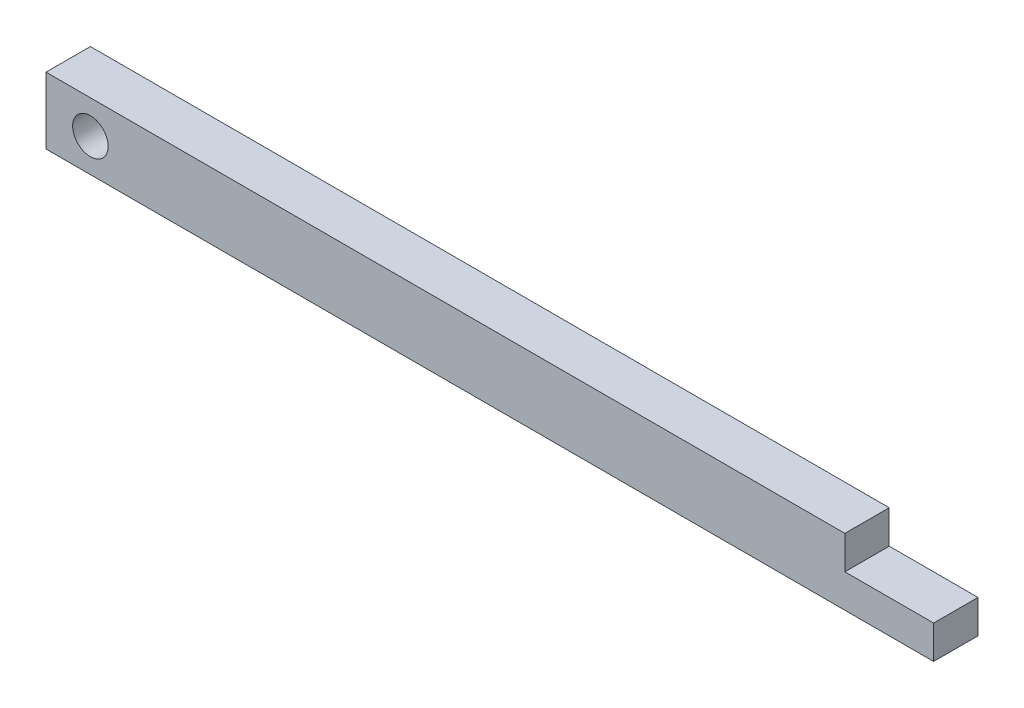
ISO-10303-21;
HEADER;
FILE_DESCRIPTION(('STEP AP214'),'2;1');
FILE_NAME('part.step','',(''),(''),'','','');
FILE_SCHEMA(('AUTOMOTIVE_DESIGN { 1 0 10303 214 1 1 1 1 }'));
ENDSEC;
DATA;
#1=APPLICATION_CONTEXT('core data for automotive mechanical design processes');
#2=APPLICATION_PROTOCOL_DEFINITION('international standard','automotive_design',2000,#1);
#3=PRODUCT_CONTEXT('',#1,'mechanical');
#4=PRODUCT('Part','Part','',(#3));
#5=PRODUCT_RELATED_PRODUCT_CATEGORY('part','',(#4));
#6=PRODUCT_DEFINITION_FORMATION('','',#4);
#7=PRODUCT_DEFINITION_CONTEXT('part definition',#1,'design');
#8=PRODUCT_DEFINITION('design','',#6,#7);
#9=PRODUCT_DEFINITION_SHAPE('','',#8);
#10=(LENGTH_UNIT() NAMED_UNIT(*) SI_UNIT(.MILLI.,.METRE.));
#11=(NAMED_UNIT(*) PLANE_ANGLE_UNIT() SI_UNIT($,.RADIAN.));
#12=(NAMED_UNIT(*) SI_UNIT($,.STERADIAN.) SOLID_ANGLE_UNIT());
#13=UNCERTAINTY_MEASURE_WITH_UNIT(LENGTH_MEASURE(1.E-05),#10,'distance_accuracy_value','');
#14=(GEOMETRIC_REPRESENTATION_CONTEXT(3) GLOBAL_UNCERTAINTY_ASSIGNED_CONTEXT((#13)) GLOBAL_UNIT_ASSIGNED_CONTEXT((#10,
#11,#12)) REPRESENTATION_CONTEXT('',''));
#15=CARTESIAN_POINT('',(0.,0.,0.));
#16=DIRECTION('',(0.,0.,1.));
#17=DIRECTION('',(1.,0.,0.));
#18=AXIS2_PLACEMENT_3D('',#15,#16,#17);
#19=CARTESIAN_POINT('',(0.,0.,10.));
#20=DIRECTION('',(-1.,0.,0.));
#21=DIRECTION('',(0.,0.,1.));
#22=AXIS2_PLACEMENT_3D('',#19,#20,#21);
#23=PLANE('',#22);
#24=DIRECTION('',(0.,1.,0.));
#25=VECTOR('',#24,1.);
#26=CARTESIAN_POINT('',(0.,0.,0.));
#27=LINE('',#26,#25);
#28=CARTESIAN_POINT('',(0.,0.,0.));
#29=VERTEX_POINT('',#28);
#30=CARTESIAN_POINT('',(0.,15.,0.));
#31=VERTEX_POINT('',#30);
#32=EDGE_CURVE('E131',#29,#31,#27,.T.);
#33=ORIENTED_EDGE('',*,*,#32,.F.);
#34=DIRECTION('',(0.,0.,-1.));
#35=VECTOR('',#34,1.);
#36=CARTESIAN_POINT('',(0.,0.,10.));
#37=LINE('',#36,#35);
#38=CARTESIAN_POINT('',(0.,0.,10.));
#39=VERTEX_POINT('',#38);
#40=EDGE_CURVE('E11',#39,#29,#37,.T.);
#41=ORIENTED_EDGE('',*,*,#40,.F.);
#42=DIRECTION('',(0.,1.,0.));
#43=VECTOR('',#42,1.);
#44=CARTESIAN_POINT('',(0.,0.,10.));
#45=LINE('',#44,#43);
#46=CARTESIAN_POINT('',(0.,15.,10.));
#47=VERTEX_POINT('',#46);
#48=EDGE_CURVE('E150',#39,#47,#45,.T.);
#49=ORIENTED_EDGE('',*,*,#48,.T.);
#50=DIRECTION('',(0.,0.,-1.));
#51=VECTOR('',#50,1.);
#52=CARTESIAN_POINT('',(0.,15.,10.));
#53=LINE('',#52,#51);
#54=EDGE_CURVE('E42',#47,#31,#53,.T.);
#55=ORIENTED_EDGE('',*,*,#54,.T.);
#56=EDGE_LOOP('',(#33,#41,#49,#55));
#57=FACE_BOUND('',#56,.T.);
#58=ADVANCED_FACE('F39',(#57),#23,.T.);
#59=CARTESIAN_POINT('',(0.,0.,10.));
#60=DIRECTION('',(0.,1.,0.));
#61=DIRECTION('',(0.,0.,1.));
#62=AXIS2_PLACEMENT_3D('',#59,#60,#61);
#63=PLANE('',#62);
#64=DIRECTION('',(1.,0.,0.));
#65=VECTOR('',#64,1.);
#66=CARTESIAN_POINT('',(0.,0.,0.));
#67=LINE('',#66,#65);
#68=CARTESIAN_POINT('',(200.,0.,0.));
#69=VERTEX_POINT('',#68);
#70=EDGE_CURVE('E79',#29,#69,#67,.T.);
#71=ORIENTED_EDGE('',*,*,#70,.T.);
#72=DIRECTION('',(0.,0.,-1.));
#73=VECTOR('',#72,1.);
#74=CARTESIAN_POINT('',(200.,0.,10.));
#75=LINE('',#74,#73);
#76=CARTESIAN_POINT('',(200.,0.,10.));
#77=VERTEX_POINT('',#76);
#78=EDGE_CURVE('E49',#77,#69,#75,.T.);
#79=ORIENTED_EDGE('',*,*,#78,.F.);
#80=DIRECTION('',(1.,0.,0.));
#81=VECTOR('',#80,1.);
#82=CARTESIAN_POINT('',(0.,0.,10.));
#83=LINE('',#82,#81);
#84=EDGE_CURVE('E104',#39,#77,#83,.T.);
#85=ORIENTED_EDGE('',*,*,#84,.F.);
#86=ORIENTED_EDGE('',*,*,#40,.T.);
#87=EDGE_LOOP('',(#71,#79,#85,#86));
#88=FACE_BOUND('',#87,.T.);
#89=ADVANCED_FACE('F192',(#88),#63,.F.);
#90=CARTESIAN_POINT('',(200.,0.,10.));
#91=DIRECTION('',(-1.,0.,0.));
#92=DIRECTION('',(0.,0.,1.));
#93=AXIS2_PLACEMENT_3D('',#90,#91,#92);
#94=PLANE('',#93);
#95=DIRECTION('',(0.,1.,0.));
#96=VECTOR('',#95,1.);
#97=CARTESIAN_POINT('',(200.,0.,0.));
#98=LINE('',#97,#96);
#99=CARTESIAN_POINT('',(200.,7.5,0.));
#100=VERTEX_POINT('',#99);
#101=EDGE_CURVE('E112',#69,#100,#98,.T.);
#102=ORIENTED_EDGE('',*,*,#101,.T.);
#103=DIRECTION('',(0.,0.,-1.));
#104=VECTOR('',#103,1.);
#105=CARTESIAN_POINT('',(200.,7.5,10.));
#106=LINE('',#105,#104);
#107=CARTESIAN_POINT('',(200.,7.5,10.));
#108=VERTEX_POINT('',#107);
#109=EDGE_CURVE('E109',#108,#100,#106,.T.);
#110=ORIENTED_EDGE('',*,*,#109,.F.);
#111=DIRECTION('',(0.,1.,0.));
#112=VECTOR('',#111,1.);
#113=CARTESIAN_POINT('',(200.,0.,10.));
#114=LINE('',#113,#112);
#115=EDGE_CURVE('E97',#77,#108,#114,.T.);
#116=ORIENTED_EDGE('',*,*,#115,.F.);
#117=ORIENTED_EDGE('',*,*,#78,.T.);
#118=EDGE_LOOP('',(#102,#110,#116,#117));
#119=FACE_BOUND('',#118,.T.);
#120=ADVANCED_FACE('F110',(#119),#94,.F.);
#121=CARTESIAN_POINT('',(200.,7.5,10.));
#122=DIRECTION('',(0.,-1.,0.));
#123=DIRECTION('',(1.,0.,0.));
#124=AXIS2_PLACEMENT_3D('',#121,#122,#123);
#125=PLANE('',#124);
#126=DIRECTION('',(-1.,0.,0.));
#127=VECTOR('',#126,1.);
#128=CARTESIAN_POINT('',(200.,7.5,0.));
#129=LINE('',#128,#127);
#130=CARTESIAN_POINT('',(180.,7.5,0.));
#131=VERTEX_POINT('',#130);
#132=EDGE_CURVE('E144',#100,#131,#129,.T.);
#133=ORIENTED_EDGE('',*,*,#132,.T.);
#134=DIRECTION('',(0.,0.,-1.));
#135=VECTOR('',#134,1.);
#136=CARTESIAN_POINT('',(180.,7.5,10.));
#137=LINE('',#136,#135);
#138=CARTESIAN_POINT('',(180.,7.5,10.));
#139=VERTEX_POINT('',#138);
#140=EDGE_CURVE('E116',#139,#131,#137,.T.);
#141=ORIENTED_EDGE('',*,*,#140,.F.);
#142=DIRECTION('',(-1.,0.,0.));
#143=VECTOR('',#142,1.);
#144=CARTESIAN_POINT('',(200.,7.5,10.));
#145=LINE('',#144,#143);
#146=EDGE_CURVE('E102',#108,#139,#145,.T.);
#147=ORIENTED_EDGE('',*,*,#146,.F.);
#148=ORIENTED_EDGE('',*,*,#109,.T.);
#149=EDGE_LOOP('',(#133,#141,#147,#148));
#150=FACE_BOUND('',#149,.T.);
#151=ADVANCED_FACE('F118',(#150),#125,.F.);
#152=CARTESIAN_POINT('',(180.,7.5,10.));
#153=DIRECTION('',(-1.,0.,0.));
#154=DIRECTION('',(0.,0.,1.));
#155=AXIS2_PLACEMENT_3D('',#152,#153,#154);
#156=PLANE('',#155);
#157=DIRECTION('',(0.,1.,0.));
#158=VECTOR('',#157,1.);
#159=CARTESIAN_POINT('',(180.,7.5,0.));
#160=LINE('',#159,#158);
#161=CARTESIAN_POINT('',(180.,15.,0.));
#162=VERTEX_POINT('',#161);
#163=EDGE_CURVE('E140',#131,#162,#160,.T.);
#164=ORIENTED_EDGE('',*,*,#163,.T.);
#165=DIRECTION('',(0.,0.,-1.));
#166=VECTOR('',#165,1.);
#167=CARTESIAN_POINT('',(180.,15.,10.));
#168=LINE('',#167,#166);
#169=CARTESIAN_POINT('',(180.,15.,10.));
#170=VERTEX_POINT('',#169);
#171=EDGE_CURVE('E155',#170,#162,#168,.T.);
#172=ORIENTED_EDGE('',*,*,#171,.F.);
#173=DIRECTION('',(0.,1.,0.));
#174=VECTOR('',#173,1.);
#175=CARTESIAN_POINT('',(180.,7.5,10.));
#176=LINE('',#175,#174);
#177=EDGE_CURVE('E122',#139,#170,#176,.T.);
#178=ORIENTED_EDGE('',*,*,#177,.F.);
#179=ORIENTED_EDGE('',*,*,#140,.T.);
#180=EDGE_LOOP('',(#164,#172,#178,#179));
#181=FACE_BOUND('',#180,.T.);
#182=ADVANCED_FACE('F164',(#181),#156,.F.);
#183=CARTESIAN_POINT('',(0.,15.,10.));
#184=DIRECTION('',(0.,1.,0.));
#185=DIRECTION('',(0.,0.,1.));
#186=AXIS2_PLACEMENT_3D('',#183,#184,#185);
#187=PLANE('',#186);
#188=DIRECTION('',(1.,0.,0.));
#189=VECTOR('',#188,1.);
#190=CARTESIAN_POINT('',(0.,15.,0.));
#191=LINE('',#190,#189);
#192=EDGE_CURVE('E135',#31,#162,#191,.T.);
#193=ORIENTED_EDGE('',*,*,#192,.F.);
#194=ORIENTED_EDGE('',*,*,#54,.F.);
#195=DIRECTION('',(1.,0.,0.));
#196=VECTOR('',#195,1.);
#197=CARTESIAN_POINT('',(0.,15.,10.));
#198=LINE('',#197,#196);
#199=EDGE_CURVE('E125',#47,#170,#198,.T.);
#200=ORIENTED_EDGE('',*,*,#199,.T.);
#201=ORIENTED_EDGE('',*,*,#171,.T.);
#202=EDGE_LOOP('',(#193,#194,#200,#201));
#203=FACE_BOUND('',#202,.T.);
#204=ADVANCED_FACE('F159',(#203),#187,.T.);
#205=CARTESIAN_POINT('',(0.,0.,10.));
#206=DIRECTION('',(0.,0.,-1.));
#207=DIRECTION('',(-1.,0.,0.));
#208=AXIS2_PLACEMENT_3D('',#205,#206,#207);
#209=PLANE('',#208);
#210=CARTESIAN_POINT('',(10.,7.5,10.));
#211=DIRECTION('',(0.,0.,1.));
#212=DIRECTION('',(1.,0.,0.));
#213=AXIS2_PLACEMENT_3D('',#210,#211,#212);
#214=CIRCLE('',#213,4.);
#215=CARTESIAN_POINT('',(14.,7.5,10.));
#216=VERTEX_POINT('',#215);
#217=EDGE_CURVE('E169',#216,#216,#214,.T.);
#218=ORIENTED_EDGE('',*,*,#217,.F.);
#219=EDGE_LOOP('',(#218));
#220=FACE_BOUND('',#219,.T.);
#221=ORIENTED_EDGE('',*,*,#48,.F.);
#222=ORIENTED_EDGE('',*,*,#84,.T.);
#223=ORIENTED_EDGE('',*,*,#115,.T.);
#224=ORIENTED_EDGE('',*,*,#146,.T.);
#225=ORIENTED_EDGE('',*,*,#177,.T.);
#226=ORIENTED_EDGE('',*,*,#199,.F.);
#227=EDGE_LOOP('',(#221,#222,#223,#224,#225,#226));
#228=FACE_BOUND('',#227,.T.);
#229=ADVANCED_FACE('F100',(#220,#228),#209,.F.);
#230=CARTESIAN_POINT('',(0.,0.,0.));
#231=DIRECTION('',(0.,0.,-1.));
#232=DIRECTION('',(-1.,0.,0.));
#233=AXIS2_PLACEMENT_3D('',#230,#231,#232);
#234=PLANE('',#233);
#235=CARTESIAN_POINT('',(10.,7.5,0.));
#236=DIRECTION('',(0.,0.,1.));
#237=DIRECTION('',(1.,0.,0.));
#238=AXIS2_PLACEMENT_3D('',#235,#236,#237);
#239=CIRCLE('',#238,4.);
#240=CARTESIAN_POINT('',(14.,7.5,0.));
#241=VERTEX_POINT('',#240);
#242=EDGE_CURVE('E136',#241,#241,#239,.T.);
#243=ORIENTED_EDGE('',*,*,#242,.T.);
#244=EDGE_LOOP('',(#243));
#245=FACE_BOUND('',#244,.T.);
#246=ORIENTED_EDGE('',*,*,#32,.T.);
#247=ORIENTED_EDGE('',*,*,#192,.T.);
#248=ORIENTED_EDGE('',*,*,#163,.F.);
#249=ORIENTED_EDGE('',*,*,#132,.F.);
#250=ORIENTED_EDGE('',*,*,#101,.F.);
#251=ORIENTED_EDGE('',*,*,#70,.F.);
#252=EDGE_LOOP('',(#246,#247,#248,#249,#250,#251));
#253=FACE_BOUND('',#252,.T.);
#254=ADVANCED_FACE('F162',(#245,#253),#234,.T.);
#255=CARTESIAN_POINT('',(10.,7.5,0.));
#256=DIRECTION('',(0.,0.,1.));
#257=DIRECTION('',(1.,0.,0.));
#258=AXIS2_PLACEMENT_3D('',#255,#256,#257);
#259=CYLINDRICAL_SURFACE('',#258,4.);
#260=ORIENTED_EDGE('',*,*,#242,.F.);
#261=EDGE_LOOP('',(#260));
#262=FACE_BOUND('',#261,.T.);
#263=ORIENTED_EDGE('',*,*,#217,.T.);
#264=EDGE_LOOP('',(#263));
#265=FACE_BOUND('',#264,.T.);
#266=ADVANCED_FACE('F178',(#262,#265),#259,.F.);
#267=CLOSED_SHELL('',(#58,#89,#120,#151,#182,#204,#229,#254,#266));
#268=MANIFOLD_SOLID_BREP('B2',#267);
#269=ADVANCED_BREP_SHAPE_REPRESENTATION('',(#18,#268),#14);
#270=SHAPE_DEFINITION_REPRESENTATION(#9,#269);
ENDSEC;
END-ISO-10303-21;
